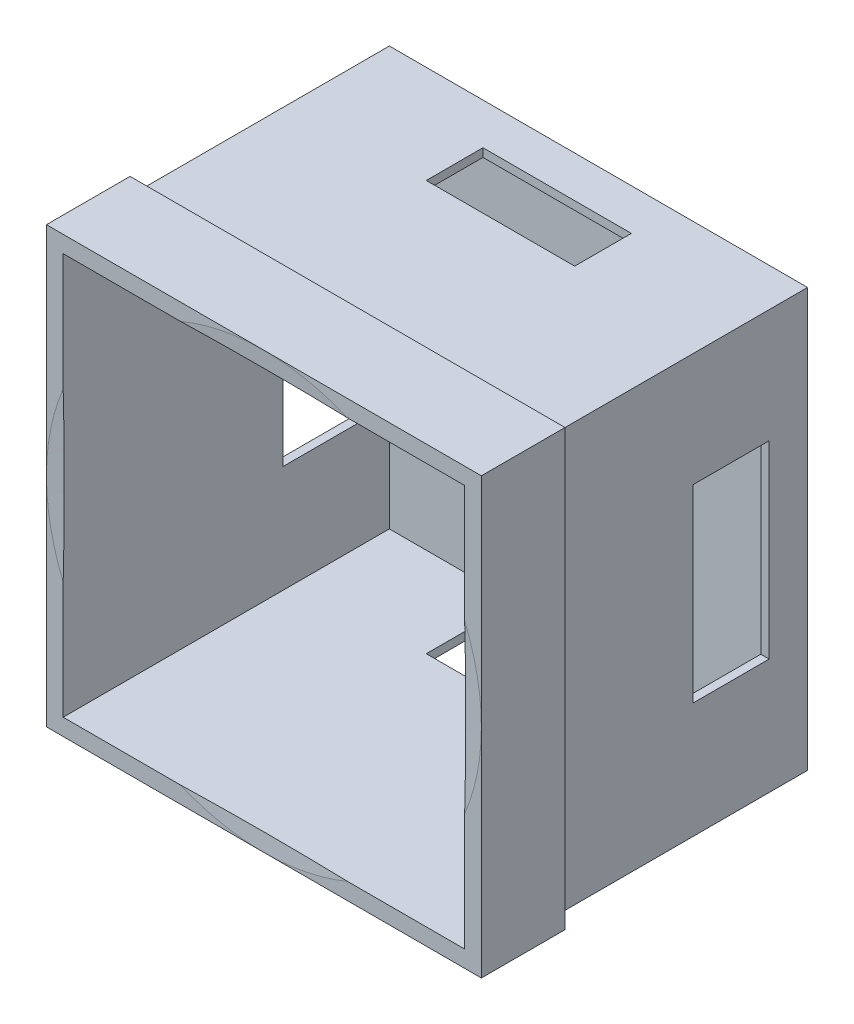
ISO-10303-21;
HEADER;
FILE_DESCRIPTION(('STEP AP214'),'2;1');
FILE_NAME('part.step','',(''),(''),'','','');
FILE_SCHEMA(('AUTOMOTIVE_DESIGN { 1 0 10303 214 1 1 1 1 }'));
ENDSEC;
DATA;
#1=APPLICATION_CONTEXT('core data for automotive mechanical design processes');
#2=APPLICATION_PROTOCOL_DEFINITION('international standard','automotive_design',2000,#1);
#3=PRODUCT_CONTEXT('',#1,'mechanical');
#4=PRODUCT('Part','Part','',(#3));
#5=PRODUCT_RELATED_PRODUCT_CATEGORY('part','',(#4));
#6=PRODUCT_DEFINITION_FORMATION('','',#4);
#7=PRODUCT_DEFINITION_CONTEXT('part definition',#1,'design');
#8=PRODUCT_DEFINITION('design','',#6,#7);
#9=PRODUCT_DEFINITION_SHAPE('','',#8);
#10=(LENGTH_UNIT() NAMED_UNIT(*) SI_UNIT(.MILLI.,.METRE.));
#11=(NAMED_UNIT(*) PLANE_ANGLE_UNIT() SI_UNIT($,.RADIAN.));
#12=(NAMED_UNIT(*) SI_UNIT($,.STERADIAN.) SOLID_ANGLE_UNIT());
#13=UNCERTAINTY_MEASURE_WITH_UNIT(LENGTH_MEASURE(1.E-05),#10,'distance_accuracy_value','');
#14=(GEOMETRIC_REPRESENTATION_CONTEXT(3) GLOBAL_UNCERTAINTY_ASSIGNED_CONTEXT((#13)) GLOBAL_UNIT_ASSIGNED_CONTEXT((#10,
#11,#12)) REPRESENTATION_CONTEXT('',''));
#15=CARTESIAN_POINT('',(0.,0.,0.));
#16=DIRECTION('',(0.,0.,1.));
#17=DIRECTION('',(1.,0.,0.));
#18=AXIS2_PLACEMENT_3D('',#15,#16,#17);
#19=CARTESIAN_POINT('',(0.,0.,25.4));
#20=DIRECTION('',(0.,0.,1.));
#21=DIRECTION('',(1.,0.,0.));
#22=AXIS2_PLACEMENT_3D('',#19,#20,#21);
#23=PLANE('',#22);
#24=CARTESIAN_POINT('',(-63.5,63.5,25.4));
#25=DIRECTION('',(0.,0.,1.));
#26=DIRECTION('',(1.,0.,0.));
#27=AXIS2_PLACEMENT_3D('',#24,#25,#26);
#28=CIRCLE('',#27,66.0399999999987);
#29=CARTESIAN_POINT('',(-38.1000000000035,124.46,25.4));
#30=VERTEX_POINT('',#29);
#31=CARTESIAN_POINT('',(-63.5,129.54,25.4));
#32=VERTEX_POINT('',#31);
#33=EDGE_CURVE('E476',#30,#32,#28,.T.);
#34=ORIENTED_EDGE('',*,*,#33,.F.);
#35=DIRECTION('',(1.,0.,0.));
#36=VECTOR('',#35,1.);
#37=CARTESIAN_POINT('',(0.,124.46,25.4));
#38=LINE('',#37,#36);
#39=CARTESIAN_POINT('',(-2.54,124.46,25.4));
#40=VERTEX_POINT('',#39);
#41=EDGE_CURVE('E385',#30,#40,#38,.T.);
#42=ORIENTED_EDGE('',*,*,#41,.T.);
#43=DIRECTION('',(0.,-1.,0.));
#44=VECTOR('',#43,1.);
#45=CARTESIAN_POINT('',(-2.54,0.,25.4));
#46=LINE('',#45,#44);
#47=CARTESIAN_POINT('',(-2.54,88.8999999999965,25.4));
#48=VERTEX_POINT('',#47);
#49=EDGE_CURVE('E373',#40,#48,#46,.T.);
#50=ORIENTED_EDGE('',*,*,#49,.T.);
#51=CARTESIAN_POINT('',(2.54,63.5,25.4));
#52=VERTEX_POINT('',#51);
#53=EDGE_CURVE('E475',#52,#48,#28,.T.);
#54=ORIENTED_EDGE('',*,*,#53,.F.);
#55=DIRECTION('',(0.,1.,0.));
#56=VECTOR('',#55,1.);
#57=CARTESIAN_POINT('',(2.54,0.,25.4));
#58=LINE('',#57,#56);
#59=CARTESIAN_POINT('',(2.54,129.54,25.4));
#60=VERTEX_POINT('',#59);
#61=EDGE_CURVE('E401',#52,#60,#58,.T.);
#62=ORIENTED_EDGE('',*,*,#61,.T.);
#63=DIRECTION('',(-1.,0.,0.));
#64=VECTOR('',#63,1.);
#65=CARTESIAN_POINT('',(0.,129.54,25.4));
#66=LINE('',#65,#64);
#67=EDGE_CURVE('E390',#60,#32,#66,.T.);
#68=ORIENTED_EDGE('',*,*,#67,.T.);
#69=EDGE_LOOP('',(#34,#42,#50,#54,#62,#68));
#70=FACE_BOUND('',#69,.T.);
#71=ADVANCED_FACE('F38',(#70),#23,.T.);
#72=CARTESIAN_POINT('',(-88.8999999999965,124.46,25.4));
#73=VERTEX_POINT('',#72);
#74=EDGE_CURVE('E577',#32,#73,#28,.T.);
#75=ORIENTED_EDGE('',*,*,#74,.F.);
#76=CARTESIAN_POINT('',(-129.54,129.54,25.4));
#77=VERTEX_POINT('',#76);
#78=EDGE_CURVE('E389',#32,#77,#66,.T.);
#79=ORIENTED_EDGE('',*,*,#78,.T.);
#80=DIRECTION('',(0.,-1.,0.));
#81=VECTOR('',#80,1.);
#82=CARTESIAN_POINT('',(-129.54,0.,25.4));
#83=LINE('',#82,#81);
#84=CARTESIAN_POINT('',(-129.54,63.5,25.4));
#85=VERTEX_POINT('',#84);
#86=EDGE_CURVE('E394',#77,#85,#83,.T.);
#87=ORIENTED_EDGE('',*,*,#86,.T.);
#88=CARTESIAN_POINT('',(-124.46,88.8999999999965,25.4));
#89=VERTEX_POINT('',#88);
#90=EDGE_CURVE('E566',#89,#85,#28,.T.);
#91=ORIENTED_EDGE('',*,*,#90,.F.);
#92=DIRECTION('',(0.,1.,0.));
#93=VECTOR('',#92,1.);
#94=CARTESIAN_POINT('',(-124.46,0.,25.4));
#95=LINE('',#94,#93);
#96=CARTESIAN_POINT('',(-124.46,124.46,25.4));
#97=VERTEX_POINT('',#96);
#98=EDGE_CURVE('E381',#89,#97,#95,.T.);
#99=ORIENTED_EDGE('',*,*,#98,.T.);
#100=EDGE_CURVE('E386',#97,#73,#38,.T.);
#101=ORIENTED_EDGE('',*,*,#100,.T.);
#102=EDGE_LOOP('',(#75,#79,#87,#91,#99,#101));
#103=FACE_BOUND('',#102,.T.);
#104=ADVANCED_FACE('F526',(#103),#23,.T.);
#105=CARTESIAN_POINT('',(-124.46,38.1000000000035,25.4));
#106=VERTEX_POINT('',#105);
#107=EDGE_CURVE('E560',#85,#106,#28,.T.);
#108=ORIENTED_EDGE('',*,*,#107,.F.);
#109=CARTESIAN_POINT('',(-129.54,-2.54,25.4));
#110=VERTEX_POINT('',#109);
#111=EDGE_CURVE('E393',#85,#110,#83,.T.);
#112=ORIENTED_EDGE('',*,*,#111,.T.);
#113=DIRECTION('',(1.,0.,0.));
#114=VECTOR('',#113,1.);
#115=CARTESIAN_POINT('',(0.,-2.54,25.4));
#116=LINE('',#115,#114);
#117=CARTESIAN_POINT('',(-63.5,-2.54,25.4));
#118=VERTEX_POINT('',#117);
#119=EDGE_CURVE('E398',#110,#118,#116,.T.);
#120=ORIENTED_EDGE('',*,*,#119,.T.);
#121=CARTESIAN_POINT('',(-88.8999999999965,2.54,25.4));
#122=VERTEX_POINT('',#121);
#123=EDGE_CURVE('E567',#122,#118,#28,.T.);
#124=ORIENTED_EDGE('',*,*,#123,.F.);
#125=DIRECTION('',(-1.,0.,0.));
#126=VECTOR('',#125,1.);
#127=CARTESIAN_POINT('',(0.,2.54,25.4));
#128=LINE('',#127,#126);
#129=CARTESIAN_POINT('',(-124.46,2.54,25.4));
#130=VERTEX_POINT('',#129);
#131=EDGE_CURVE('E376',#122,#130,#128,.T.);
#132=ORIENTED_EDGE('',*,*,#131,.T.);
#133=EDGE_CURVE('E382',#130,#106,#95,.T.);
#134=ORIENTED_EDGE('',*,*,#133,.T.);
#135=EDGE_LOOP('',(#108,#112,#120,#124,#132,#134));
#136=FACE_BOUND('',#135,.T.);
#137=ADVANCED_FACE('F533',(#136),#23,.T.);
#138=CARTESIAN_POINT('',(-124.46,127.,-76.2));
#139=DIRECTION('',(1.,0.,0.));
#140=DIRECTION('',(0.,0.,-1.));
#141=AXIS2_PLACEMENT_3D('',#138,#139,#140);
#142=PLANE('',#141);
#143=DIRECTION('',(0.,-1.,0.));
#144=VECTOR('',#143,1.);
#145=CARTESIAN_POINT('',(-124.46,127.,-41.3415266757801));
#146=LINE('',#145,#144);
#147=CARTESIAN_POINT('',(-124.46,92.5219763679745,-41.3415266757801));
#148=VERTEX_POINT('',#147);
#149=CARTESIAN_POINT('',(-124.46,35.0998842441029,-41.3415266757801));
#150=VERTEX_POINT('',#149);
#151=EDGE_CURVE('E361',#148,#150,#146,.T.);
#152=ORIENTED_EDGE('',*,*,#151,.F.);
#153=DIRECTION('',(0.,0.,1.));
#154=VECTOR('',#153,1.);
#155=CARTESIAN_POINT('',(-124.46,92.5219763679745,-76.2));
#156=LINE('',#155,#154);
#157=CARTESIAN_POINT('',(-124.46,92.5219763679745,-64.5390606908852));
#158=VERTEX_POINT('',#157);
#159=EDGE_CURVE('E347',#158,#148,#156,.T.);
#160=ORIENTED_EDGE('',*,*,#159,.F.);
#161=DIRECTION('',(0.,1.,0.));
#162=VECTOR('',#161,1.);
#163=CARTESIAN_POINT('',(-124.46,127.,-64.5390606908852));
#164=LINE('',#163,#162);
#165=CARTESIAN_POINT('',(-124.46,35.0998842441029,-64.5390606908852));
#166=VERTEX_POINT('',#165);
#167=EDGE_CURVE('E351',#166,#158,#164,.T.);
#168=ORIENTED_EDGE('',*,*,#167,.F.);
#169=DIRECTION('',(0.,0.,-1.));
#170=VECTOR('',#169,1.);
#171=CARTESIAN_POINT('',(-124.46,35.0998842441029,-76.2));
#172=LINE('',#171,#170);
#173=EDGE_CURVE('E356',#150,#166,#172,.T.);
#174=ORIENTED_EDGE('',*,*,#173,.F.);
#175=EDGE_LOOP('',(#152,#160,#168,#174));
#176=FACE_BOUND('',#175,.T.);
#177=CARTESIAN_POINT('',(-124.46,63.5,1013.7962152902));
#178=DIRECTION('',(1.,0.,0.));
#179=DIRECTION('',(0.,0.,-1.));
#180=AXIS2_PLACEMENT_3D('',#177,#178,#179);
#181=CIRCLE('',#180,988.722528518492);
#182=EDGE_CURVE('E367',#106,#89,#181,.T.);
#183=ORIENTED_EDGE('',*,*,#182,.F.);
#184=ORIENTED_EDGE('',*,*,#133,.F.);
#185=DIRECTION('',(0.,0.,1.));
#186=VECTOR('',#185,1.);
#187=CARTESIAN_POINT('',(-124.46,2.54,-76.2));
#188=LINE('',#187,#186);
#189=CARTESIAN_POINT('',(-124.46,2.54,-73.66));
#190=VERTEX_POINT('',#189);
#191=EDGE_CURVE('E425',#190,#130,#188,.T.);
#192=ORIENTED_EDGE('',*,*,#191,.F.);
#193=DIRECTION('',(0.,-1.,0.));
#194=VECTOR('',#193,1.);
#195=CARTESIAN_POINT('',(-124.46,127.,-73.66));
#196=LINE('',#195,#194);
#197=CARTESIAN_POINT('',(-124.46,124.46,-73.66));
#198=VERTEX_POINT('',#197);
#199=EDGE_CURVE('E434',#198,#190,#196,.T.);
#200=ORIENTED_EDGE('',*,*,#199,.F.);
#201=DIRECTION('',(0.,0.,1.));
#202=VECTOR('',#201,1.);
#203=CARTESIAN_POINT('',(-124.46,124.46,-76.2));
#204=LINE('',#203,#202);
#205=EDGE_CURVE('E429',#198,#97,#204,.T.);
#206=ORIENTED_EDGE('',*,*,#205,.T.);
#207=ORIENTED_EDGE('',*,*,#98,.F.);
#208=EDGE_LOOP('',(#183,#184,#192,#200,#206,#207));
#209=FACE_BOUND('',#208,.T.);
#210=ADVANCED_FACE('F552',(#176,#209),#142,.T.);
#211=CARTESIAN_POINT('',(-2.54,127.,-76.2));
#212=DIRECTION('',(-1.,0.,0.));
#213=DIRECTION('',(0.,0.,1.));
#214=AXIS2_PLACEMENT_3D('',#211,#212,#213);
#215=PLANE('',#214);
#216=DIRECTION('',(0.,1.,0.));
#217=VECTOR('',#216,1.);
#218=CARTESIAN_POINT('',(-2.54,127.,-41.3415266757801));
#219=LINE('',#218,#217);
#220=CARTESIAN_POINT('',(-2.54,35.0998842441029,-41.3415266757801));
#221=VERTEX_POINT('',#220);
#222=CARTESIAN_POINT('',(-2.54,92.5219763679745,-41.3415266757801));
#223=VERTEX_POINT('',#222);
#224=EDGE_CURVE('E358',#221,#223,#219,.T.);
#225=ORIENTED_EDGE('',*,*,#224,.F.);
#226=DIRECTION('',(0.,0.,1.));
#227=VECTOR('',#226,1.);
#228=CARTESIAN_POINT('',(-2.54,35.0998842441029,-76.2));
#229=LINE('',#228,#227);
#230=CARTESIAN_POINT('',(-2.54,35.0998842441029,-64.5390606908852));
#231=VERTEX_POINT('',#230);
#232=EDGE_CURVE('E354',#231,#221,#229,.T.);
#233=ORIENTED_EDGE('',*,*,#232,.F.);
#234=DIRECTION('',(0.,-1.,0.));
#235=VECTOR('',#234,1.);
#236=CARTESIAN_POINT('',(-2.54,127.,-64.5390606908852));
#237=LINE('',#236,#235);
#238=CARTESIAN_POINT('',(-2.54,92.5219763679745,-64.5390606908852));
#239=VERTEX_POINT('',#238);
#240=EDGE_CURVE('E349',#239,#231,#237,.T.);
#241=ORIENTED_EDGE('',*,*,#240,.F.);
#242=DIRECTION('',(0.,0.,-1.));
#243=VECTOR('',#242,1.);
#244=CARTESIAN_POINT('',(-2.54,92.5219763679745,-76.2));
#245=LINE('',#244,#243);
#246=EDGE_CURVE('E345',#223,#239,#245,.T.);
#247=ORIENTED_EDGE('',*,*,#246,.F.);
#248=EDGE_LOOP('',(#225,#233,#241,#247));
#249=FACE_BOUND('',#248,.T.);
#250=CARTESIAN_POINT('',(-2.54,63.5,1013.7962152902));
#251=DIRECTION('',(-1.,0.,0.));
#252=DIRECTION('',(0.,0.,1.));
#253=AXIS2_PLACEMENT_3D('',#250,#251,#252);
#254=CIRCLE('',#253,988.722528518492);
#255=CARTESIAN_POINT('',(-2.54,38.1000000000035,25.4));
#256=VERTEX_POINT('',#255);
#257=EDGE_CURVE('E363',#48,#256,#254,.T.);
#258=ORIENTED_EDGE('',*,*,#257,.F.);
#259=ORIENTED_EDGE('',*,*,#49,.F.);
#260=DIRECTION('',(0.,0.,-1.));
#261=VECTOR('',#260,1.);
#262=CARTESIAN_POINT('',(-2.54,124.46,-76.2));
#263=LINE('',#262,#261);
#264=CARTESIAN_POINT('',(-2.54,124.46,-73.66));
#265=VERTEX_POINT('',#264);
#266=EDGE_CURVE('E432',#40,#265,#263,.T.);
#267=ORIENTED_EDGE('',*,*,#266,.T.);
#268=DIRECTION('',(0.,-1.,0.));
#269=VECTOR('',#268,1.);
#270=CARTESIAN_POINT('',(-2.54,127.,-73.66));
#271=LINE('',#270,#269);
#272=CARTESIAN_POINT('',(-2.54,2.54,-73.66));
#273=VERTEX_POINT('',#272);
#274=EDGE_CURVE('E437',#265,#273,#271,.T.);
#275=ORIENTED_EDGE('',*,*,#274,.T.);
#276=DIRECTION('',(0.,0.,-1.));
#277=VECTOR('',#276,1.);
#278=CARTESIAN_POINT('',(-2.54,2.54,-76.2));
#279=LINE('',#278,#277);
#280=CARTESIAN_POINT('',(-2.54,2.54,25.4));
#281=VERTEX_POINT('',#280);
#282=EDGE_CURVE('E428',#281,#273,#279,.T.);
#283=ORIENTED_EDGE('',*,*,#282,.F.);
#284=EDGE_CURVE('E377',#256,#281,#46,.T.);
#285=ORIENTED_EDGE('',*,*,#284,.F.);
#286=EDGE_LOOP('',(#258,#259,#267,#275,#283,#285));
#287=FACE_BOUND('',#286,.T.);
#288=ADVANCED_FACE('F501',(#249,#287),#215,.T.);
#289=CARTESIAN_POINT('',(-127.,127.,-73.66));
#290=DIRECTION('',(0.,0.,1.));
#291=DIRECTION('',(1.,0.,0.));
#292=AXIS2_PLACEMENT_3D('',#289,#290,#291);
#293=PLANE('',#292);
#294=DIRECTION('',(-1.,0.,0.));
#295=VECTOR('',#294,1.);
#296=CARTESIAN_POINT('',(-127.,2.54,-73.66));
#297=LINE('',#296,#295);
#298=EDGE_CURVE('E433',#273,#190,#297,.T.);
#299=ORIENTED_EDGE('',*,*,#298,.F.);
#300=ORIENTED_EDGE('',*,*,#274,.F.);
#301=DIRECTION('',(-1.,0.,0.));
#302=VECTOR('',#301,1.);
#303=CARTESIAN_POINT('',(-127.,124.46,-73.66));
#304=LINE('',#303,#302);
#305=EDGE_CURVE('E438',#265,#198,#304,.T.);
#306=ORIENTED_EDGE('',*,*,#305,.T.);
#307=ORIENTED_EDGE('',*,*,#199,.T.);
#308=EDGE_LOOP('',(#299,#300,#306,#307));
#309=FACE_BOUND('',#308,.T.);
#310=ADVANCED_FACE('F616',(#309),#293,.T.);
#311=CARTESIAN_POINT('',(0.,124.46,0.));
#312=DIRECTION('',(0.,1.,0.));
#313=DIRECTION('',(0.,0.,1.));
#314=AXIS2_PLACEMENT_3D('',#311,#312,#313);
#315=PLANE('',#314);
#316=DIRECTION('',(-1.,0.,0.));
#317=VECTOR('',#316,1.);
#318=CARTESIAN_POINT('',(0.,124.46,-63.6586862377372));
#319=LINE('',#318,#317);
#320=CARTESIAN_POINT('',(-40.9678424834969,124.46,-63.6586862377372));
#321=VERTEX_POINT('',#320);
#322=CARTESIAN_POINT('',(-86.0321575165031,124.46,-63.6586862377372));
#323=VERTEX_POINT('',#322);
#324=EDGE_CURVE('E297',#321,#323,#319,.T.);
#325=ORIENTED_EDGE('',*,*,#324,.T.);
#326=DIRECTION('',(0.,0.,1.));
#327=VECTOR('',#326,1.);
#328=CARTESIAN_POINT('',(-86.0321575165031,124.46,0.));
#329=LINE('',#328,#327);
#330=CARTESIAN_POINT('',(-86.0321575165031,124.46,-46.4432997543112));
#331=VERTEX_POINT('',#330);
#332=EDGE_CURVE('E318',#323,#331,#329,.T.);
#333=ORIENTED_EDGE('',*,*,#332,.T.);
#334=DIRECTION('',(1.,0.,0.));
#335=VECTOR('',#334,1.);
#336=CARTESIAN_POINT('',(0.,124.46,-46.4432997543112));
#337=LINE('',#336,#335);
#338=CARTESIAN_POINT('',(-40.9678424834969,124.46,-46.4432997543112));
#339=VERTEX_POINT('',#338);
#340=EDGE_CURVE('E311',#331,#339,#337,.T.);
#341=ORIENTED_EDGE('',*,*,#340,.T.);
#342=DIRECTION('',(0.,0.,-1.));
#343=VECTOR('',#342,1.);
#344=CARTESIAN_POINT('',(-40.9678424834969,124.46,0.));
#345=LINE('',#344,#343);
#346=EDGE_CURVE('E304',#339,#321,#345,.T.);
#347=ORIENTED_EDGE('',*,*,#346,.T.);
#348=EDGE_LOOP('',(#325,#333,#341,#347));
#349=FACE_BOUND('',#348,.T.);
#350=ORIENTED_EDGE('',*,*,#41,.F.);
#351=CARTESIAN_POINT('',(-63.5,124.46,1013.7962152902));
#352=DIRECTION('',(0.,1.,0.));
#353=DIRECTION('',(0.,0.,1.));
#354=AXIS2_PLACEMENT_3D('',#351,#352,#353);
#355=CIRCLE('',#354,988.722528518492);
#356=EDGE_CURVE('E369',#30,#73,#355,.T.);
#357=ORIENTED_EDGE('',*,*,#356,.T.);
#358=ORIENTED_EDGE('',*,*,#100,.F.);
#359=ORIENTED_EDGE('',*,*,#205,.F.);
#360=ORIENTED_EDGE('',*,*,#305,.F.);
#361=ORIENTED_EDGE('',*,*,#266,.F.);
#362=EDGE_LOOP('',(#350,#357,#358,#359,#360,#361));
#363=FACE_BOUND('',#362,.T.);
#364=ADVANCED_FACE('F609',(#349,#363),#315,.F.);
#365=CARTESIAN_POINT('',(0.,2.54,0.));
#366=DIRECTION('',(0.,1.,0.));
#367=DIRECTION('',(0.,0.,1.));
#368=AXIS2_PLACEMENT_3D('',#365,#366,#367);
#369=PLANE('',#368);
#370=DIRECTION('',(0.,0.,1.));
#371=VECTOR('',#370,1.);
#372=CARTESIAN_POINT('',(-86.0321575165031,2.54,0.));
#373=LINE('',#372,#371);
#374=CARTESIAN_POINT('',(-86.0321575165031,2.53999999999999,-63.6586862377372));
#375=VERTEX_POINT('',#374);
#376=CARTESIAN_POINT('',(-86.0321575165031,2.53999999999999,-46.4432997543112));
#377=VERTEX_POINT('',#376);
#378=EDGE_CURVE('E316',#375,#377,#373,.T.);
#379=ORIENTED_EDGE('',*,*,#378,.F.);
#380=DIRECTION('',(-1.,0.,0.));
#381=VECTOR('',#380,1.);
#382=CARTESIAN_POINT('',(0.,2.54,-63.6586862377372));
#383=LINE('',#382,#381);
#384=CARTESIAN_POINT('',(-40.9678424834969,2.54,-63.6586862377372));
#385=VERTEX_POINT('',#384);
#386=EDGE_CURVE('E295',#385,#375,#383,.T.);
#387=ORIENTED_EDGE('',*,*,#386,.F.);
#388=DIRECTION('',(0.,0.,-1.));
#389=VECTOR('',#388,1.);
#390=CARTESIAN_POINT('',(-40.9678424834969,2.54,0.));
#391=LINE('',#390,#389);
#392=CARTESIAN_POINT('',(-40.9678424834969,2.53999999999999,-46.4432997543112));
#393=VERTEX_POINT('',#392);
#394=EDGE_CURVE('E264',#393,#385,#391,.T.);
#395=ORIENTED_EDGE('',*,*,#394,.F.);
#396=DIRECTION('',(1.,0.,0.));
#397=VECTOR('',#396,1.);
#398=CARTESIAN_POINT('',(0.,2.54,-46.4432997543112));
#399=LINE('',#398,#397);
#400=EDGE_CURVE('E309',#377,#393,#399,.T.);
#401=ORIENTED_EDGE('',*,*,#400,.F.);
#402=EDGE_LOOP('',(#379,#387,#395,#401));
#403=FACE_BOUND('',#402,.T.);
#404=CARTESIAN_POINT('',(-63.5,2.54,1013.7962152902));
#405=DIRECTION('',(0.,1.,0.));
#406=DIRECTION('',(0.,0.,1.));
#407=AXIS2_PLACEMENT_3D('',#404,#405,#406);
#408=CIRCLE('',#407,988.722528518492);
#409=CARTESIAN_POINT('',(-38.1000000000035,2.54,25.4));
#410=VERTEX_POINT('',#409);
#411=EDGE_CURVE('E365',#410,#122,#408,.T.);
#412=ORIENTED_EDGE('',*,*,#411,.F.);
#413=EDGE_CURVE('E378',#281,#410,#128,.T.);
#414=ORIENTED_EDGE('',*,*,#413,.F.);
#415=ORIENTED_EDGE('',*,*,#282,.T.);
#416=ORIENTED_EDGE('',*,*,#298,.T.);
#417=ORIENTED_EDGE('',*,*,#191,.T.);
#418=ORIENTED_EDGE('',*,*,#131,.F.);
#419=EDGE_LOOP('',(#412,#414,#415,#416,#417,#418));
#420=FACE_BOUND('',#419,.T.);
#421=ADVANCED_FACE('F601',(#403,#420),#369,.T.);
#422=CARTESIAN_POINT('',(0.,0.,0.));
#423=DIRECTION('',(0.,0.,1.));
#424=DIRECTION('',(1.,0.,0.));
#425=AXIS2_PLACEMENT_3D('',#422,#423,#424);
#426=PLANE('',#425);
#427=DIRECTION('',(-1.,0.,0.));
#428=VECTOR('',#427,1.);
#429=CARTESIAN_POINT('',(0.,129.54,0.));
#430=LINE('',#429,#428);
#431=CARTESIAN_POINT('',(2.54,129.54,0.));
#432=VERTEX_POINT('',#431);
#433=CARTESIAN_POINT('',(-129.54,129.54,0.));
#434=VERTEX_POINT('',#433);
#435=EDGE_CURVE('E372',#432,#434,#430,.T.);
#436=ORIENTED_EDGE('',*,*,#435,.F.);
#437=DIRECTION('',(0.,1.,0.));
#438=VECTOR('',#437,1.);
#439=CARTESIAN_POINT('',(2.54,0.,0.));
#440=LINE('',#439,#438);
#441=CARTESIAN_POINT('',(2.54,-2.54,0.));
#442=VERTEX_POINT('',#441);
#443=EDGE_CURVE('E412',#442,#432,#440,.T.);
#444=ORIENTED_EDGE('',*,*,#443,.F.);
#445=DIRECTION('',(1.,0.,0.));
#446=VECTOR('',#445,1.);
#447=CARTESIAN_POINT('',(0.,-2.54,0.));
#448=LINE('',#447,#446);
#449=CARTESIAN_POINT('',(-129.54,-2.54,0.));
#450=VERTEX_POINT('',#449);
#451=EDGE_CURVE('E410',#450,#442,#448,.T.);
#452=ORIENTED_EDGE('',*,*,#451,.F.);
#453=DIRECTION('',(0.,-1.,0.));
#454=VECTOR('',#453,1.);
#455=CARTESIAN_POINT('',(-129.54,0.,0.));
#456=LINE('',#455,#454);
#457=EDGE_CURVE('E408',#434,#450,#456,.T.);
#458=ORIENTED_EDGE('',*,*,#457,.F.);
#459=EDGE_LOOP('',(#436,#444,#452,#458));
#460=FACE_BOUND('',#459,.T.);
#461=DIRECTION('',(0.,-1.,0.));
#462=VECTOR('',#461,1.);
#463=CARTESIAN_POINT('',(-127.,127.,0.));
#464=LINE('',#463,#462);
#465=CARTESIAN_POINT('',(-127.,127.,0.));
#466=VERTEX_POINT('',#465);
#467=CARTESIAN_POINT('',(-127.,0.,0.));
#468=VERTEX_POINT('',#467);
#469=EDGE_CURVE('E470',#466,#468,#464,.T.);
#470=ORIENTED_EDGE('',*,*,#469,.T.);
#471=DIRECTION('',(1.,0.,0.));
#472=VECTOR('',#471,1.);
#473=CARTESIAN_POINT('',(-127.,0.,0.));
#474=LINE('',#473,#472);
#475=CARTESIAN_POINT('',(0.,0.,0.));
#476=VERTEX_POINT('',#475);
#477=EDGE_CURVE('E457',#468,#476,#474,.T.);
#478=ORIENTED_EDGE('',*,*,#477,.T.);
#479=DIRECTION('',(0.,-1.,0.));
#480=VECTOR('',#479,1.);
#481=CARTESIAN_POINT('',(0.,127.,0.));
#482=LINE('',#481,#480);
#483=CARTESIAN_POINT('',(0.,127.,0.));
#484=VERTEX_POINT('',#483);
#485=EDGE_CURVE('E468',#484,#476,#482,.T.);
#486=ORIENTED_EDGE('',*,*,#485,.F.);
#487=DIRECTION('',(1.,0.,0.));
#488=VECTOR('',#487,1.);
#489=CARTESIAN_POINT('',(-127.,127.,0.));
#490=LINE('',#489,#488);
#491=EDGE_CURVE('E448',#466,#484,#490,.T.);
#492=ORIENTED_EDGE('',*,*,#491,.F.);
#493=EDGE_LOOP('',(#470,#478,#486,#492));
#494=FACE_BOUND('',#493,.T.);
#495=ADVANCED_FACE('F589',(#460,#494),#426,.F.);
#496=CARTESIAN_POINT('',(0.,129.54,25.4));
#497=DIRECTION('',(0.,-1.,0.));
#498=DIRECTION('',(0.,0.,-1.));
#499=AXIS2_PLACEMENT_3D('',#496,#497,#498);
#500=PLANE('',#499);
#501=ORIENTED_EDGE('',*,*,#435,.T.);
#502=DIRECTION('',(0.,0.,-1.));
#503=VECTOR('',#502,1.);
#504=CARTESIAN_POINT('',(-129.54,129.54,25.4));
#505=LINE('',#504,#503);
#506=EDGE_CURVE('E422',#77,#434,#505,.T.);
#507=ORIENTED_EDGE('',*,*,#506,.F.);
#508=ORIENTED_EDGE('',*,*,#78,.F.);
#509=ORIENTED_EDGE('',*,*,#67,.F.);
#510=DIRECTION('',(0.,0.,-1.));
#511=VECTOR('',#510,1.);
#512=CARTESIAN_POINT('',(2.54,129.54,25.4));
#513=LINE('',#512,#511);
#514=EDGE_CURVE('E405',#60,#432,#513,.T.);
#515=ORIENTED_EDGE('',*,*,#514,.T.);
#516=EDGE_LOOP('',(#501,#507,#508,#509,#515));
#517=FACE_BOUND('',#516,.T.);
#518=ADVANCED_FACE('F580',(#517),#500,.F.);
#519=CARTESIAN_POINT('',(-129.54,0.,25.4));
#520=DIRECTION('',(1.,0.,0.));
#521=DIRECTION('',(0.,0.,-1.));
#522=AXIS2_PLACEMENT_3D('',#519,#520,#521);
#523=PLANE('',#522);
#524=ORIENTED_EDGE('',*,*,#457,.T.);
#525=DIRECTION('',(0.,0.,-1.));
#526=VECTOR('',#525,1.);
#527=CARTESIAN_POINT('',(-129.54,-2.54,25.4));
#528=LINE('',#527,#526);
#529=EDGE_CURVE('E419',#110,#450,#528,.T.);
#530=ORIENTED_EDGE('',*,*,#529,.F.);
#531=ORIENTED_EDGE('',*,*,#111,.F.);
#532=ORIENTED_EDGE('',*,*,#86,.F.);
#533=ORIENTED_EDGE('',*,*,#506,.T.);
#534=EDGE_LOOP('',(#524,#530,#531,#532,#533));
#535=FACE_BOUND('',#534,.T.);
#536=ADVANCED_FACE('F570',(#535),#523,.F.);
#537=CARTESIAN_POINT('',(0.,-2.54,25.4));
#538=DIRECTION('',(0.,1.,0.));
#539=DIRECTION('',(0.,0.,1.));
#540=AXIS2_PLACEMENT_3D('',#537,#538,#539);
#541=PLANE('',#540);
#542=ORIENTED_EDGE('',*,*,#451,.T.);
#543=DIRECTION('',(0.,0.,-1.));
#544=VECTOR('',#543,1.);
#545=CARTESIAN_POINT('',(2.54,-2.54,25.4));
#546=LINE('',#545,#544);
#547=CARTESIAN_POINT('',(2.54,-2.54,25.4));
#548=VERTEX_POINT('',#547);
#549=EDGE_CURVE('E416',#548,#442,#546,.T.);
#550=ORIENTED_EDGE('',*,*,#549,.F.);
#551=EDGE_CURVE('E397',#118,#548,#116,.T.);
#552=ORIENTED_EDGE('',*,*,#551,.F.);
#553=ORIENTED_EDGE('',*,*,#119,.F.);
#554=ORIENTED_EDGE('',*,*,#529,.T.);
#555=EDGE_LOOP('',(#542,#550,#552,#553,#554));
#556=FACE_BOUND('',#555,.T.);
#557=ADVANCED_FACE('F547',(#556),#541,.F.);
#558=CARTESIAN_POINT('',(2.54,0.,25.4));
#559=DIRECTION('',(-1.,0.,0.));
#560=DIRECTION('',(0.,0.,1.));
#561=AXIS2_PLACEMENT_3D('',#558,#559,#560);
#562=PLANE('',#561);
#563=ORIENTED_EDGE('',*,*,#443,.T.);
#564=ORIENTED_EDGE('',*,*,#514,.F.);
#565=ORIENTED_EDGE('',*,*,#61,.F.);
#566=EDGE_CURVE('E402',#548,#52,#58,.T.);
#567=ORIENTED_EDGE('',*,*,#566,.F.);
#568=ORIENTED_EDGE('',*,*,#549,.T.);
#569=EDGE_LOOP('',(#563,#564,#565,#567,#568));
#570=FACE_BOUND('',#569,.T.);
#571=ADVANCED_FACE('F539',(#570),#562,.F.);
#572=EDGE_CURVE('E598',#118,#410,#28,.T.);
#573=ORIENTED_EDGE('',*,*,#572,.F.);
#574=ORIENTED_EDGE('',*,*,#551,.T.);
#575=ORIENTED_EDGE('',*,*,#566,.T.);
#576=EDGE_CURVE('E473',#256,#52,#28,.T.);
#577=ORIENTED_EDGE('',*,*,#576,.F.);
#578=ORIENTED_EDGE('',*,*,#284,.T.);
#579=ORIENTED_EDGE('',*,*,#413,.T.);
#580=EDGE_LOOP('',(#573,#574,#575,#577,#578,#579));
#581=FACE_BOUND('',#580,.T.);
#582=ADVANCED_FACE('F529',(#581),#23,.T.);
#583=CARTESIAN_POINT('',(-127.,127.,-76.2));
#584=DIRECTION('',(0.,0.,1.));
#585=DIRECTION('',(1.,0.,0.));
#586=AXIS2_PLACEMENT_3D('',#583,#584,#585);
#587=PLANE('',#586);
#588=DIRECTION('',(-1.,0.,0.));
#589=VECTOR('',#588,1.);
#590=CARTESIAN_POINT('',(-127.,0.,-76.2));
#591=LINE('',#590,#589);
#592=CARTESIAN_POINT('',(0.,0.,-76.2));
#593=VERTEX_POINT('',#592);
#594=CARTESIAN_POINT('',(-127.,0.,-76.2));
#595=VERTEX_POINT('',#594);
#596=EDGE_CURVE('E449',#593,#595,#591,.T.);
#597=ORIENTED_EDGE('',*,*,#596,.T.);
#598=DIRECTION('',(0.,-1.,0.));
#599=VECTOR('',#598,1.);
#600=CARTESIAN_POINT('',(-127.,127.,-76.2));
#601=LINE('',#600,#599);
#602=CARTESIAN_POINT('',(-127.,127.,-76.2));
#603=VERTEX_POINT('',#602);
#604=EDGE_CURVE('E455',#603,#595,#601,.T.);
#605=ORIENTED_EDGE('',*,*,#604,.F.);
#606=DIRECTION('',(-1.,0.,0.));
#607=VECTOR('',#606,1.);
#608=CARTESIAN_POINT('',(-127.,127.,-76.2));
#609=LINE('',#608,#607);
#610=CARTESIAN_POINT('',(0.,127.,-76.2));
#611=VERTEX_POINT('',#610);
#612=EDGE_CURVE('E453',#611,#603,#609,.T.);
#613=ORIENTED_EDGE('',*,*,#612,.F.);
#614=DIRECTION('',(0.,-1.,0.));
#615=VECTOR('',#614,1.);
#616=CARTESIAN_POINT('',(0.,127.,-76.2));
#617=LINE('',#616,#615);
#618=EDGE_CURVE('E465',#611,#593,#617,.T.);
#619=ORIENTED_EDGE('',*,*,#618,.T.);
#620=EDGE_LOOP('',(#597,#605,#613,#619));
#621=FACE_BOUND('',#620,.T.);
#622=ADVANCED_FACE('F538',(#621),#587,.F.);
#623=CARTESIAN_POINT('',(-127.,127.,-76.2));
#624=DIRECTION('',(1.,0.,0.));
#625=DIRECTION('',(0.,0.,-1.));
#626=AXIS2_PLACEMENT_3D('',#623,#624,#625);
#627=PLANE('',#626);
#628=DIRECTION('',(0.,0.,-1.));
#629=VECTOR('',#628,1.);
#630=CARTESIAN_POINT('',(-127.,92.5219763679745,-41.3415266757801));
#631=LINE('',#630,#629);
#632=CARTESIAN_POINT('',(-127.,92.5219763679745,-41.3415266757801));
#633=VERTEX_POINT('',#632);
#634=CARTESIAN_POINT('',(-127.,92.5219763679745,-64.5390606908852));
#635=VERTEX_POINT('',#634);
#636=EDGE_CURVE('E323',#633,#635,#631,.T.);
#637=ORIENTED_EDGE('',*,*,#636,.F.);
#638=DIRECTION('',(0.,1.,0.));
#639=VECTOR('',#638,1.);
#640=CARTESIAN_POINT('',(-127.,92.5219763679745,-41.3415266757801));
#641=LINE('',#640,#639);
#642=CARTESIAN_POINT('',(-127.,35.0998842441029,-41.3415266757801));
#643=VERTEX_POINT('',#642);
#644=EDGE_CURVE('E321',#643,#633,#641,.T.);
#645=ORIENTED_EDGE('',*,*,#644,.F.);
#646=DIRECTION('',(0.,0.,1.));
#647=VECTOR('',#646,1.);
#648=CARTESIAN_POINT('',(-127.,35.0998842441029,-41.3415266757801));
#649=LINE('',#648,#647);
#650=CARTESIAN_POINT('',(-127.,35.0998842441029,-64.5390606908852));
#651=VERTEX_POINT('',#650);
#652=EDGE_CURVE('E329',#651,#643,#649,.T.);
#653=ORIENTED_EDGE('',*,*,#652,.F.);
#654=DIRECTION('',(0.,-1.,0.));
#655=VECTOR('',#654,1.);
#656=CARTESIAN_POINT('',(-127.,92.5219763679745,-64.5390606908852));
#657=LINE('',#656,#655);
#658=EDGE_CURVE('E326',#635,#651,#657,.T.);
#659=ORIENTED_EDGE('',*,*,#658,.F.);
#660=EDGE_LOOP('',(#637,#645,#653,#659));
#661=FACE_BOUND('',#660,.T.);
#662=DIRECTION('',(0.,0.,1.));
#663=VECTOR('',#662,1.);
#664=CARTESIAN_POINT('',(-127.,0.,-76.2));
#665=LINE('',#664,#663);
#666=EDGE_CURVE('E443',#595,#468,#665,.T.);
#667=ORIENTED_EDGE('',*,*,#666,.T.);
#668=ORIENTED_EDGE('',*,*,#469,.F.);
#669=DIRECTION('',(0.,0.,1.));
#670=VECTOR('',#669,1.);
#671=CARTESIAN_POINT('',(-127.,127.,-76.2));
#672=LINE('',#671,#670);
#673=EDGE_CURVE('E446',#603,#466,#672,.T.);
#674=ORIENTED_EDGE('',*,*,#673,.F.);
#675=ORIENTED_EDGE('',*,*,#604,.T.);
#676=EDGE_LOOP('',(#667,#668,#674,#675));
#677=FACE_BOUND('',#676,.T.);
#678=ADVANCED_FACE('F40',(#661,#677),#627,.F.);
#679=CARTESIAN_POINT('',(0.,127.,0.));
#680=DIRECTION('',(0.,1.,0.));
#681=DIRECTION('',(0.,0.,1.));
#682=AXIS2_PLACEMENT_3D('',#679,#680,#681);
#683=PLANE('',#682);
#684=DIRECTION('',(0.,0.,1.));
#685=VECTOR('',#684,1.);
#686=CARTESIAN_POINT('',(-86.0321575165031,127.,0.));
#687=LINE('',#686,#685);
#688=CARTESIAN_POINT('',(-86.0321575165031,127.,-63.6586862377372));
#689=VERTEX_POINT('',#688);
#690=CARTESIAN_POINT('',(-86.0321575165031,127.,-46.4432997543112));
#691=VERTEX_POINT('',#690);
#692=EDGE_CURVE('E314',#689,#691,#687,.T.);
#693=ORIENTED_EDGE('',*,*,#692,.F.);
#694=DIRECTION('',(-1.,0.,0.));
#695=VECTOR('',#694,1.);
#696=CARTESIAN_POINT('',(0.,127.,-63.6586862377372));
#697=LINE('',#696,#695);
#698=CARTESIAN_POINT('',(-40.9678424834969,127.,-63.6586862377372));
#699=VERTEX_POINT('',#698);
#700=EDGE_CURVE('E293',#699,#689,#697,.T.);
#701=ORIENTED_EDGE('',*,*,#700,.F.);
#702=DIRECTION('',(0.,0.,-1.));
#703=VECTOR('',#702,1.);
#704=CARTESIAN_POINT('',(-40.9678424834969,127.,0.));
#705=LINE('',#704,#703);
#706=CARTESIAN_POINT('',(-40.9678424834969,127.,-46.4432997543112));
#707=VERTEX_POINT('',#706);
#708=EDGE_CURVE('E300',#707,#699,#705,.T.);
#709=ORIENTED_EDGE('',*,*,#708,.F.);
#710=DIRECTION('',(1.,0.,0.));
#711=VECTOR('',#710,1.);
#712=CARTESIAN_POINT('',(0.,127.,-46.4432997543112));
#713=LINE('',#712,#711);
#714=EDGE_CURVE('E307',#691,#707,#713,.T.);
#715=ORIENTED_EDGE('',*,*,#714,.F.);
#716=EDGE_LOOP('',(#693,#701,#709,#715));
#717=FACE_BOUND('',#716,.T.);
#718=ORIENTED_EDGE('',*,*,#673,.T.);
#719=ORIENTED_EDGE('',*,*,#491,.T.);
#720=DIRECTION('',(0.,0.,-1.));
#721=VECTOR('',#720,1.);
#722=CARTESIAN_POINT('',(0.,127.,-76.2));
#723=LINE('',#722,#721);
#724=EDGE_CURVE('E451',#484,#611,#723,.T.);
#725=ORIENTED_EDGE('',*,*,#724,.T.);
#726=ORIENTED_EDGE('',*,*,#612,.T.);
#727=EDGE_LOOP('',(#718,#719,#725,#726));
#728=FACE_BOUND('',#727,.T.);
#729=ADVANCED_FACE('F653',(#717,#728),#683,.T.);
#730=CARTESIAN_POINT('',(0.,127.,-76.2));
#731=DIRECTION('',(-1.,0.,0.));
#732=DIRECTION('',(0.,0.,1.));
#733=AXIS2_PLACEMENT_3D('',#730,#731,#732);
#734=PLANE('',#733);
#735=DIRECTION('',(0.,0.,1.));
#736=VECTOR('',#735,1.);
#737=CARTESIAN_POINT('',(0.,35.0998842441029,-76.2));
#738=LINE('',#737,#736);
#739=CARTESIAN_POINT('',(0.,35.0998842441029,-64.5390606908852));
#740=VERTEX_POINT('',#739);
#741=CARTESIAN_POINT('',(0.,35.0998842441029,-41.3415266757801));
#742=VERTEX_POINT('',#741);
#743=EDGE_CURVE('E46',#740,#742,#738,.T.);
#744=ORIENTED_EDGE('',*,*,#743,.T.);
#745=DIRECTION('',(0.,1.,0.));
#746=VECTOR('',#745,1.);
#747=CARTESIAN_POINT('',(0.,127.,-41.3415266757801));
#748=LINE('',#747,#746);
#749=CARTESIAN_POINT('',(0.,92.5219763679745,-41.3415266757801));
#750=VERTEX_POINT('',#749);
#751=EDGE_CURVE('E11',#742,#750,#748,.T.);
#752=ORIENTED_EDGE('',*,*,#751,.T.);
#753=DIRECTION('',(0.,0.,-1.));
#754=VECTOR('',#753,1.);
#755=CARTESIAN_POINT('',(0.,92.5219763679745,-76.2));
#756=LINE('',#755,#754);
#757=CARTESIAN_POINT('',(0.,92.5219763679745,-64.5390606908852));
#758=VERTEX_POINT('',#757);
#759=EDGE_CURVE('E477',#750,#758,#756,.T.);
#760=ORIENTED_EDGE('',*,*,#759,.T.);
#761=DIRECTION('',(0.,-1.,0.));
#762=VECTOR('',#761,1.);
#763=CARTESIAN_POINT('',(0.,127.,-64.5390606908852));
#764=LINE('',#763,#762);
#765=EDGE_CURVE('E480',#758,#740,#764,.T.);
#766=ORIENTED_EDGE('',*,*,#765,.T.);
#767=EDGE_LOOP('',(#744,#752,#760,#766));
#768=FACE_BOUND('',#767,.T.);
#769=DIRECTION('',(0.,0.,-1.));
#770=VECTOR('',#769,1.);
#771=CARTESIAN_POINT('',(0.,0.,-76.2));
#772=LINE('',#771,#770);
#773=EDGE_CURVE('E460',#476,#593,#772,.T.);
#774=ORIENTED_EDGE('',*,*,#773,.T.);
#775=ORIENTED_EDGE('',*,*,#618,.F.);
#776=ORIENTED_EDGE('',*,*,#724,.F.);
#777=ORIENTED_EDGE('',*,*,#485,.T.);
#778=EDGE_LOOP('',(#774,#775,#776,#777));
#779=FACE_BOUND('',#778,.T.);
#780=ADVANCED_FACE('F484',(#768,#779),#734,.F.);
#781=CARTESIAN_POINT('',(0.,0.,0.));
#782=DIRECTION('',(0.,1.,0.));
#783=DIRECTION('',(0.,0.,1.));
#784=AXIS2_PLACEMENT_3D('',#781,#782,#783);
#785=PLANE('',#784);
#786=DIRECTION('',(1.,0.,0.));
#787=VECTOR('',#786,1.);
#788=CARTESIAN_POINT('',(-86.0321575165031,0.,-63.6586862377372));
#789=LINE('',#788,#787);
#790=CARTESIAN_POINT('',(-86.0321575165031,0.,-63.6586862377372));
#791=VERTEX_POINT('',#790);
#792=CARTESIAN_POINT('',(-40.9678424834969,0.,-63.6586862377372));
#793=VERTEX_POINT('',#792);
#794=EDGE_CURVE('E270',#791,#793,#789,.T.);
#795=ORIENTED_EDGE('',*,*,#794,.F.);
#796=DIRECTION('',(0.,0.,-1.));
#797=VECTOR('',#796,1.);
#798=CARTESIAN_POINT('',(-86.0321575165031,0.,-46.4432997543112));
#799=LINE('',#798,#797);
#800=CARTESIAN_POINT('',(-86.0321575165031,0.,-46.4432997543112));
#801=VERTEX_POINT('',#800);
#802=EDGE_CURVE('E276',#801,#791,#799,.T.);
#803=ORIENTED_EDGE('',*,*,#802,.F.);
#804=DIRECTION('',(-1.,0.,0.));
#805=VECTOR('',#804,1.);
#806=CARTESIAN_POINT('',(-86.0321575165031,0.,-46.4432997543112));
#807=LINE('',#806,#805);
#808=CARTESIAN_POINT('',(-40.9678424834969,0.,-46.4432997543112));
#809=VERTEX_POINT('',#808);
#810=EDGE_CURVE('E281',#809,#801,#807,.T.);
#811=ORIENTED_EDGE('',*,*,#810,.F.);
#812=DIRECTION('',(0.,0.,1.));
#813=VECTOR('',#812,1.);
#814=CARTESIAN_POINT('',(-40.9678424834969,0.,-46.4432997543112));
#815=LINE('',#814,#813);
#816=EDGE_CURVE('E261',#793,#809,#815,.T.);
#817=ORIENTED_EDGE('',*,*,#816,.F.);
#818=EDGE_LOOP('',(#795,#803,#811,#817));
#819=FACE_BOUND('',#818,.T.);
#820=ORIENTED_EDGE('',*,*,#666,.F.);
#821=ORIENTED_EDGE('',*,*,#596,.F.);
#822=ORIENTED_EDGE('',*,*,#773,.F.);
#823=ORIENTED_EDGE('',*,*,#477,.F.);
#824=EDGE_LOOP('',(#820,#821,#822,#823));
#825=FACE_BOUND('',#824,.T.);
#826=ADVANCED_FACE('F278',(#819,#825),#785,.F.);
#827=CARTESIAN_POINT('',(-63.5,63.5,1013.7962152902));
#828=DIRECTION('',(0.,0.,1.));
#829=DIRECTION('',(0.,1.,0.));
#830=AXIS2_PLACEMENT_3D('',#827,#828,#829);
#831=SPHERICAL_SURFACE('',#830,990.6);
#832=ORIENTED_EDGE('',*,*,#257,.T.);
#833=ORIENTED_EDGE('',*,*,#576,.T.);
#834=ORIENTED_EDGE('',*,*,#53,.T.);
#835=EDGE_LOOP('',(#832,#833,#834));
#836=FACE_BOUND('',#835,.T.);
#837=ADVANCED_FACE('F521',(#836),#831,.F.);
#838=ORIENTED_EDGE('',*,*,#411,.T.);
#839=ORIENTED_EDGE('',*,*,#123,.T.);
#840=ORIENTED_EDGE('',*,*,#572,.T.);
#841=EDGE_LOOP('',(#838,#839,#840));
#842=FACE_BOUND('',#841,.T.);
#843=ADVANCED_FACE('F622',(#842),#831,.F.);
#844=ORIENTED_EDGE('',*,*,#182,.T.);
#845=ORIENTED_EDGE('',*,*,#90,.T.);
#846=ORIENTED_EDGE('',*,*,#107,.T.);
#847=EDGE_LOOP('',(#844,#845,#846));
#848=FACE_BOUND('',#847,.T.);
#849=ADVANCED_FACE('F518',(#848),#831,.F.);
#850=ORIENTED_EDGE('',*,*,#33,.T.);
#851=ORIENTED_EDGE('',*,*,#74,.T.);
#852=ORIENTED_EDGE('',*,*,#356,.F.);
#853=EDGE_LOOP('',(#850,#851,#852));
#854=FACE_BOUND('',#853,.T.);
#855=ADVANCED_FACE('F509',(#854),#831,.F.);
#856=CARTESIAN_POINT('',(2.53999999999999,92.5219763679745,-41.3415266757801));
#857=DIRECTION('',(0.,1.,0.));
#858=DIRECTION('',(0.,0.,1.));
#859=AXIS2_PLACEMENT_3D('',#856,#857,#858);
#860=PLANE('',#859);
#861=ORIENTED_EDGE('',*,*,#246,.T.);
#862=DIRECTION('',(-1.,0.,0.));
#863=VECTOR('',#862,1.);
#864=CARTESIAN_POINT('',(2.53999999999999,92.5219763679745,-64.5390606908852));
#865=LINE('',#864,#863);
#866=EDGE_CURVE('E339',#758,#239,#865,.T.);
#867=ORIENTED_EDGE('',*,*,#866,.F.);
#868=ORIENTED_EDGE('',*,*,#759,.F.);
#869=DIRECTION('',(-1.,0.,0.));
#870=VECTOR('',#869,1.);
#871=CARTESIAN_POINT('',(2.53999999999999,92.5219763679745,-41.3415266757801));
#872=LINE('',#871,#870);
#873=EDGE_CURVE('E342',#750,#223,#872,.T.);
#874=ORIENTED_EDGE('',*,*,#873,.T.);
#875=EDGE_LOOP('',(#861,#867,#868,#874));
#876=FACE_BOUND('',#875,.T.);
#877=ADVANCED_FACE('F507',(#876),#860,.F.);
#878=CARTESIAN_POINT('',(2.53999999999999,92.5219763679745,-64.5390606908852));
#879=DIRECTION('',(0.,0.,-1.));
#880=DIRECTION('',(-1.,0.,0.));
#881=AXIS2_PLACEMENT_3D('',#878,#879,#880);
#882=PLANE('',#881);
#883=ORIENTED_EDGE('',*,*,#240,.T.);
#884=DIRECTION('',(-1.,0.,0.));
#885=VECTOR('',#884,1.);
#886=CARTESIAN_POINT('',(2.53999999999999,35.0998842441029,-64.5390606908852));
#887=LINE('',#886,#885);
#888=EDGE_CURVE('E336',#740,#231,#887,.T.);
#889=ORIENTED_EDGE('',*,*,#888,.F.);
#890=ORIENTED_EDGE('',*,*,#765,.F.);
#891=ORIENTED_EDGE('',*,*,#866,.T.);
#892=EDGE_LOOP('',(#883,#889,#890,#891));
#893=FACE_BOUND('',#892,.T.);
#894=ADVANCED_FACE('F495',(#893),#882,.F.);
#895=CARTESIAN_POINT('',(2.53999999999999,35.0998842441029,-41.3415266757801));
#896=DIRECTION('',(0.,-1.,0.));
#897=DIRECTION('',(0.,0.,-1.));
#898=AXIS2_PLACEMENT_3D('',#895,#896,#897);
#899=PLANE('',#898);
#900=ORIENTED_EDGE('',*,*,#232,.T.);
#901=DIRECTION('',(-1.,0.,0.));
#902=VECTOR('',#901,1.);
#903=CARTESIAN_POINT('',(2.53999999999999,35.0998842441029,-41.3415266757801));
#904=LINE('',#903,#902);
#905=EDGE_CURVE('E335',#742,#221,#904,.T.);
#906=ORIENTED_EDGE('',*,*,#905,.F.);
#907=ORIENTED_EDGE('',*,*,#743,.F.);
#908=ORIENTED_EDGE('',*,*,#888,.T.);
#909=EDGE_LOOP('',(#900,#906,#907,#908));
#910=FACE_BOUND('',#909,.T.);
#911=ADVANCED_FACE('F491',(#910),#899,.F.);
#912=CARTESIAN_POINT('',(2.53999999999999,92.5219763679745,-41.3415266757801));
#913=DIRECTION('',(0.,0.,1.));
#914=DIRECTION('',(0.,-1.,0.));
#915=AXIS2_PLACEMENT_3D('',#912,#913,#914);
#916=PLANE('',#915);
#917=ORIENTED_EDGE('',*,*,#224,.T.);
#918=ORIENTED_EDGE('',*,*,#873,.F.);
#919=ORIENTED_EDGE('',*,*,#751,.F.);
#920=ORIENTED_EDGE('',*,*,#905,.T.);
#921=EDGE_LOOP('',(#917,#918,#919,#920));
#922=FACE_BOUND('',#921,.T.);
#923=ADVANCED_FACE('F504',(#922),#916,.F.);
#924=ORIENTED_EDGE('',*,*,#151,.T.);
#925=EDGE_CURVE('E333',#150,#643,#904,.T.);
#926=ORIENTED_EDGE('',*,*,#925,.T.);
#927=ORIENTED_EDGE('',*,*,#644,.T.);
#928=EDGE_CURVE('E332',#148,#633,#872,.T.);
#929=ORIENTED_EDGE('',*,*,#928,.F.);
#930=EDGE_LOOP('',(#924,#926,#927,#929));
#931=FACE_BOUND('',#930,.T.);
#932=ADVANCED_FACE('F628',(#931),#916,.F.);
#933=ORIENTED_EDGE('',*,*,#173,.T.);
#934=EDGE_CURVE('E337',#166,#651,#887,.T.);
#935=ORIENTED_EDGE('',*,*,#934,.T.);
#936=ORIENTED_EDGE('',*,*,#652,.T.);
#937=ORIENTED_EDGE('',*,*,#925,.F.);
#938=EDGE_LOOP('',(#933,#935,#936,#937));
#939=FACE_BOUND('',#938,.T.);
#940=ADVANCED_FACE('F630',(#939),#899,.F.);
#941=ORIENTED_EDGE('',*,*,#167,.T.);
#942=EDGE_CURVE('E340',#158,#635,#865,.T.);
#943=ORIENTED_EDGE('',*,*,#942,.T.);
#944=ORIENTED_EDGE('',*,*,#658,.T.);
#945=ORIENTED_EDGE('',*,*,#934,.F.);
#946=EDGE_LOOP('',(#941,#943,#944,#945));
#947=FACE_BOUND('',#946,.T.);
#948=ADVANCED_FACE('F517',(#947),#882,.F.);
#949=ORIENTED_EDGE('',*,*,#159,.T.);
#950=ORIENTED_EDGE('',*,*,#928,.T.);
#951=ORIENTED_EDGE('',*,*,#636,.T.);
#952=ORIENTED_EDGE('',*,*,#942,.F.);
#953=EDGE_LOOP('',(#949,#950,#951,#952));
#954=FACE_BOUND('',#953,.T.);
#955=ADVANCED_FACE('F511',(#954),#860,.F.);
#956=CARTESIAN_POINT('',(-86.0321575165031,129.54,-63.6586862377372));
#957=DIRECTION('',(0.,0.,-1.));
#958=DIRECTION('',(-1.,0.,0.));
#959=AXIS2_PLACEMENT_3D('',#956,#957,#958);
#960=PLANE('',#959);
#961=ORIENTED_EDGE('',*,*,#386,.T.);
#962=DIRECTION('',(0.,-1.,0.));
#963=VECTOR('',#962,1.);
#964=CARTESIAN_POINT('',(-86.0321575165031,129.54,-63.6586862377372));
#965=LINE('',#964,#963);
#966=EDGE_CURVE('E273',#375,#791,#965,.T.);
#967=ORIENTED_EDGE('',*,*,#966,.T.);
#968=ORIENTED_EDGE('',*,*,#794,.T.);
#969=DIRECTION('',(0.,-1.,0.));
#970=VECTOR('',#969,1.);
#971=CARTESIAN_POINT('',(-40.9678424834969,129.54,-63.6586862377372));
#972=LINE('',#971,#970);
#973=EDGE_CURVE('E61',#385,#793,#972,.T.);
#974=ORIENTED_EDGE('',*,*,#973,.F.);
#975=EDGE_LOOP('',(#961,#967,#968,#974));
#976=FACE_BOUND('',#975,.T.);
#977=ADVANCED_FACE('F271',(#976),#960,.F.);
#978=CARTESIAN_POINT('',(-40.9678424834969,129.54,-46.4432997543112));
#979=DIRECTION('',(1.,0.,0.));
#980=DIRECTION('',(0.,0.,-1.));
#981=AXIS2_PLACEMENT_3D('',#978,#979,#980);
#982=PLANE('',#981);
#983=ORIENTED_EDGE('',*,*,#394,.T.);
#984=ORIENTED_EDGE('',*,*,#973,.T.);
#985=ORIENTED_EDGE('',*,*,#816,.T.);
#986=DIRECTION('',(0.,-1.,0.));
#987=VECTOR('',#986,1.);
#988=CARTESIAN_POINT('',(-40.9678424834969,129.54,-46.4432997543112));
#989=LINE('',#988,#987);
#990=EDGE_CURVE('E290',#393,#809,#989,.T.);
#991=ORIENTED_EDGE('',*,*,#990,.F.);
#992=EDGE_LOOP('',(#983,#984,#985,#991));
#993=FACE_BOUND('',#992,.T.);
#994=ADVANCED_FACE('F258',(#993),#982,.F.);
#995=CARTESIAN_POINT('',(-86.0321575165031,129.54,-46.4432997543112));
#996=DIRECTION('',(0.,0.,1.));
#997=DIRECTION('',(1.,0.,0.));
#998=AXIS2_PLACEMENT_3D('',#995,#996,#997);
#999=PLANE('',#998);
#1000=ORIENTED_EDGE('',*,*,#400,.T.);
#1001=ORIENTED_EDGE('',*,*,#990,.T.);
#1002=ORIENTED_EDGE('',*,*,#810,.T.);
#1003=DIRECTION('',(0.,-1.,0.));
#1004=VECTOR('',#1003,1.);
#1005=CARTESIAN_POINT('',(-86.0321575165031,129.54,-46.4432997543112));
#1006=LINE('',#1005,#1004);
#1007=EDGE_CURVE('E286',#377,#801,#1006,.T.);
#1008=ORIENTED_EDGE('',*,*,#1007,.F.);
#1009=EDGE_LOOP('',(#1000,#1001,#1002,#1008));
#1010=FACE_BOUND('',#1009,.T.);
#1011=ADVANCED_FACE('F857',(#1010),#999,.F.);
#1012=CARTESIAN_POINT('',(-86.0321575165031,129.54,-46.4432997543112));
#1013=DIRECTION('',(-1.,0.,0.));
#1014=DIRECTION('',(0.,0.,1.));
#1015=AXIS2_PLACEMENT_3D('',#1012,#1013,#1014);
#1016=PLANE('',#1015);
#1017=ORIENTED_EDGE('',*,*,#378,.T.);
#1018=ORIENTED_EDGE('',*,*,#1007,.T.);
#1019=ORIENTED_EDGE('',*,*,#802,.T.);
#1020=ORIENTED_EDGE('',*,*,#966,.F.);
#1021=EDGE_LOOP('',(#1017,#1018,#1019,#1020));
#1022=FACE_BOUND('',#1021,.T.);
#1023=ADVANCED_FACE('F867',(#1022),#1016,.F.);
#1024=EDGE_CURVE('E53',#689,#323,#965,.T.);
#1025=ORIENTED_EDGE('',*,*,#1024,.F.);
#1026=ORIENTED_EDGE('',*,*,#692,.T.);
#1027=EDGE_CURVE('E288',#691,#331,#1006,.T.);
#1028=ORIENTED_EDGE('',*,*,#1027,.T.);
#1029=ORIENTED_EDGE('',*,*,#332,.F.);
#1030=EDGE_LOOP('',(#1025,#1026,#1028,#1029));
#1031=FACE_BOUND('',#1030,.T.);
#1032=ADVANCED_FACE('F878',(#1031),#1016,.F.);
#1033=ORIENTED_EDGE('',*,*,#1027,.F.);
#1034=ORIENTED_EDGE('',*,*,#714,.T.);
#1035=EDGE_CURVE('E289',#707,#339,#989,.T.);
#1036=ORIENTED_EDGE('',*,*,#1035,.T.);
#1037=ORIENTED_EDGE('',*,*,#340,.F.);
#1038=EDGE_LOOP('',(#1033,#1034,#1036,#1037));
#1039=FACE_BOUND('',#1038,.T.);
#1040=ADVANCED_FACE('F870',(#1039),#999,.F.);
#1041=ORIENTED_EDGE('',*,*,#1035,.F.);
#1042=ORIENTED_EDGE('',*,*,#708,.T.);
#1043=EDGE_CURVE('E266',#699,#321,#972,.T.);
#1044=ORIENTED_EDGE('',*,*,#1043,.T.);
#1045=ORIENTED_EDGE('',*,*,#346,.F.);
#1046=EDGE_LOOP('',(#1041,#1042,#1044,#1045));
#1047=FACE_BOUND('',#1046,.T.);
#1048=ADVANCED_FACE('F859',(#1047),#982,.F.);
#1049=ORIENTED_EDGE('',*,*,#1043,.F.);
#1050=ORIENTED_EDGE('',*,*,#700,.T.);
#1051=ORIENTED_EDGE('',*,*,#1024,.T.);
#1052=ORIENTED_EDGE('',*,*,#324,.F.);
#1053=EDGE_LOOP('',(#1049,#1050,#1051,#1052));
#1054=FACE_BOUND('',#1053,.T.);
#1055=ADVANCED_FACE('F849',(#1054),#960,.F.);
#1056=CLOSED_SHELL('',(#71,#104,#137,#210,#288,#310,#364,#421,#495,#518,#536,#557,#571,#582,
#622,#678,#729,#780,#826,#837,#843,#849,#855,#877,#894,#911,#923,#932,#940,#948,#955,#977,#994,
#1011,#1023,#1032,#1040,#1048,#1055));
#1057=MANIFOLD_SOLID_BREP('B2',#1056);
#1058=ADVANCED_BREP_SHAPE_REPRESENTATION('',(#18,#1057),#14);
#1059=SHAPE_DEFINITION_REPRESENTATION(#9,#1058);
ENDSEC;
END-ISO-10303-21;
